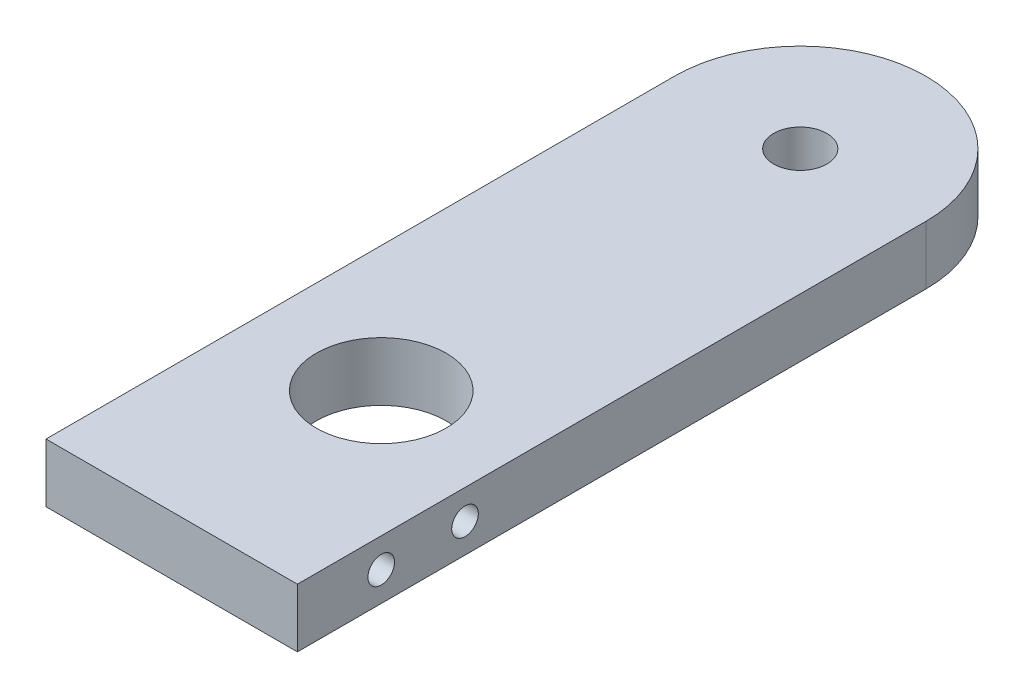
ISO-10303-21;
HEADER;
FILE_DESCRIPTION(('STEP AP214'),'2;1');
FILE_NAME('part.step','',(''),(''),'','','');
FILE_SCHEMA(('AUTOMOTIVE_DESIGN { 1 0 10303 214 1 1 1 1 }'));
ENDSEC;
DATA;
#1=APPLICATION_CONTEXT('core data for automotive mechanical design processes');
#2=APPLICATION_PROTOCOL_DEFINITION('international standard','automotive_design',2000,#1);
#3=PRODUCT_CONTEXT('',#1,'mechanical');
#4=PRODUCT('Part','Part','',(#3));
#5=PRODUCT_RELATED_PRODUCT_CATEGORY('part','',(#4));
#6=PRODUCT_DEFINITION_FORMATION('','',#4);
#7=PRODUCT_DEFINITION_CONTEXT('part definition',#1,'design');
#8=PRODUCT_DEFINITION('design','',#6,#7);
#9=PRODUCT_DEFINITION_SHAPE('','',#8);
#10=(LENGTH_UNIT() NAMED_UNIT(*) SI_UNIT(.MILLI.,.METRE.));
#11=(NAMED_UNIT(*) PLANE_ANGLE_UNIT() SI_UNIT($,.RADIAN.));
#12=(NAMED_UNIT(*) SI_UNIT($,.STERADIAN.) SOLID_ANGLE_UNIT());
#13=UNCERTAINTY_MEASURE_WITH_UNIT(LENGTH_MEASURE(1.E-05),#10,'distance_accuracy_value','');
#14=(GEOMETRIC_REPRESENTATION_CONTEXT(3) GLOBAL_UNCERTAINTY_ASSIGNED_CONTEXT((#13)) GLOBAL_UNIT_ASSIGNED_CONTEXT((#10,
#11,#12)) REPRESENTATION_CONTEXT('',''));
#15=CARTESIAN_POINT('',(0.,0.,0.));
#16=DIRECTION('',(0.,0.,1.));
#17=DIRECTION('',(1.,0.,0.));
#18=AXIS2_PLACEMENT_3D('',#15,#16,#17);
#19=CARTESIAN_POINT('',(-140.801197544741,7.,-45.351992913343));
#20=DIRECTION('',(0.,1.,0.));
#21=DIRECTION('',(0.,0.,1.));
#22=AXIS2_PLACEMENT_3D('',#19,#20,#21);
#23=PLANE('',#22);
#24=CARTESIAN_POINT('',(-140.801197544741,7.00000000000001,-45.351992913343));
#25=DIRECTION('',(0.,-1.,0.));
#26=DIRECTION('',(0.,0.,-1.));
#27=AXIS2_PLACEMENT_3D('',#24,#25,#26);
#28=CIRCLE('',#27,3.17499999999998);
#29=CARTESIAN_POINT('',(-140.801197544741,7.00000000000001,-48.526992913343));
#30=VERTEX_POINT('',#29);
#31=EDGE_CURVE('E154',#30,#30,#28,.T.);
#32=ORIENTED_EDGE('',*,*,#31,.T.);
#33=EDGE_LOOP('',(#32));
#34=FACE_BOUND('',#33,.T.);
#35=DIRECTION('',(1.,0.,0.));
#36=VECTOR('',#35,1.);
#37=CARTESIAN_POINT('',(-155.801197544741,7.,29.648007086657));
#38=LINE('',#37,#36);
#39=CARTESIAN_POINT('',(-155.801197544741,7.,29.648007086657));
#40=VERTEX_POINT('',#39);
#41=CARTESIAN_POINT('',(-125.801197544741,7.,29.648007086657));
#42=VERTEX_POINT('',#41);
#43=EDGE_CURVE('E98',#40,#42,#38,.T.);
#44=ORIENTED_EDGE('',*,*,#43,.T.);
#45=DIRECTION('',(0.,0.,-1.));
#46=VECTOR('',#45,1.);
#47=CARTESIAN_POINT('',(-125.801197544741,7.,29.648007086657));
#48=LINE('',#47,#46);
#49=CARTESIAN_POINT('',(-125.801197544741,7.,-45.351992913343));
#50=VERTEX_POINT('',#49);
#51=EDGE_CURVE('E101',#42,#50,#48,.T.);
#52=ORIENTED_EDGE('',*,*,#51,.T.);
#53=CARTESIAN_POINT('',(-140.801197544741,7.,-45.351992913343));
#54=DIRECTION('',(0.,1.,0.));
#55=DIRECTION('',(0.,0.,1.));
#56=AXIS2_PLACEMENT_3D('',#53,#54,#55);
#57=CIRCLE('',#56,15.0000000000001);
#58=CARTESIAN_POINT('',(-155.801197544741,7.,-45.351992913343));
#59=VERTEX_POINT('',#58);
#60=EDGE_CURVE('E83',#50,#59,#57,.T.);
#61=ORIENTED_EDGE('',*,*,#60,.T.);
#62=DIRECTION('',(0.,0.,1.));
#63=VECTOR('',#62,1.);
#64=CARTESIAN_POINT('',(-155.801197544741,7.,-45.351992913343));
#65=LINE('',#64,#63);
#66=EDGE_CURVE('E93',#59,#40,#65,.T.);
#67=ORIENTED_EDGE('',*,*,#66,.T.);
#68=EDGE_LOOP('',(#44,#52,#61,#67));
#69=FACE_BOUND('',#68,.T.);
#70=CARTESIAN_POINT('',(-140.801197544741,7.00000000000001,4.648007086657));
#71=DIRECTION('',(0.,-1.,0.));
#72=DIRECTION('',(0.,0.,-1.));
#73=AXIS2_PLACEMENT_3D('',#70,#71,#72);
#74=CIRCLE('',#73,7.75000000000001);
#75=CARTESIAN_POINT('',(-140.801197544741,7.00000000000001,-3.10199291334301));
#76=VERTEX_POINT('',#75);
#77=EDGE_CURVE('E164',#76,#76,#74,.T.);
#78=ORIENTED_EDGE('',*,*,#77,.T.);
#79=EDGE_LOOP('',(#78));
#80=FACE_BOUND('',#79,.T.);
#81=ADVANCED_FACE('F32',(#34,#69,#80),#23,.T.);
#82=CARTESIAN_POINT('',(-155.801197544741,0.,29.648007086657));
#83=DIRECTION('',(0.,0.,1.));
#84=DIRECTION('',(1.,0.,0.));
#85=AXIS2_PLACEMENT_3D('',#82,#83,#84);
#86=PLANE('',#85);
#87=ORIENTED_EDGE('',*,*,#43,.F.);
#88=DIRECTION('',(0.,1.,0.));
#89=VECTOR('',#88,1.);
#90=CARTESIAN_POINT('',(-155.801197544741,0.,29.648007086657));
#91=LINE('',#90,#89);
#92=CARTESIAN_POINT('',(-155.801197544741,0.,29.648007086657));
#93=VERTEX_POINT('',#92);
#94=EDGE_CURVE('E11',#93,#40,#91,.T.);
#95=ORIENTED_EDGE('',*,*,#94,.F.);
#96=DIRECTION('',(1.,0.,0.));
#97=VECTOR('',#96,1.);
#98=CARTESIAN_POINT('',(-155.801197544741,0.,29.648007086657));
#99=LINE('',#98,#97);
#100=CARTESIAN_POINT('',(-125.801197544741,0.,29.648007086657));
#101=VERTEX_POINT('',#100);
#102=EDGE_CURVE('E91',#93,#101,#99,.T.);
#103=ORIENTED_EDGE('',*,*,#102,.T.);
#104=DIRECTION('',(0.,1.,0.));
#105=VECTOR('',#104,1.);
#106=CARTESIAN_POINT('',(-125.801197544741,0.,29.648007086657));
#107=LINE('',#106,#105);
#108=EDGE_CURVE('E36',#101,#42,#107,.T.);
#109=ORIENTED_EDGE('',*,*,#108,.T.);
#110=EDGE_LOOP('',(#87,#95,#103,#109));
#111=FACE_BOUND('',#110,.T.);
#112=ADVANCED_FACE('F34',(#111),#86,.T.);
#113=CARTESIAN_POINT('',(-155.801197544741,0.,-45.351992913343));
#114=DIRECTION('',(-1.,0.,0.));
#115=DIRECTION('',(0.,0.,1.));
#116=AXIS2_PLACEMENT_3D('',#113,#114,#115);
#117=PLANE('',#116);
#118=ORIENTED_EDGE('',*,*,#66,.F.);
#119=DIRECTION('',(0.,1.,0.));
#120=VECTOR('',#119,1.);
#121=CARTESIAN_POINT('',(-155.801197544741,0.,-45.351992913343));
#122=LINE('',#121,#120);
#123=CARTESIAN_POINT('',(-155.801197544741,0.,-45.351992913343));
#124=VERTEX_POINT('',#123);
#125=EDGE_CURVE('E42',#124,#59,#122,.T.);
#126=ORIENTED_EDGE('',*,*,#125,.F.);
#127=DIRECTION('',(0.,0.,1.));
#128=VECTOR('',#127,1.);
#129=CARTESIAN_POINT('',(-155.801197544741,0.,-45.351992913343));
#130=LINE('',#129,#128);
#131=EDGE_CURVE('E88',#124,#93,#130,.T.);
#132=ORIENTED_EDGE('',*,*,#131,.T.);
#133=ORIENTED_EDGE('',*,*,#94,.T.);
#134=EDGE_LOOP('',(#118,#126,#132,#133));
#135=FACE_BOUND('',#134,.T.);
#136=ADVANCED_FACE('F109',(#135),#117,.T.);
#137=CARTESIAN_POINT('',(-140.801197544741,0.,-45.351992913343));
#138=DIRECTION('',(0.,1.,0.));
#139=DIRECTION('',(0.,0.,1.));
#140=AXIS2_PLACEMENT_3D('',#137,#138,#139);
#141=CYLINDRICAL_SURFACE('',#140,15.0000000000001);
#142=ORIENTED_EDGE('',*,*,#60,.F.);
#143=DIRECTION('',(0.,1.,0.));
#144=VECTOR('',#143,1.);
#145=CARTESIAN_POINT('',(-125.801197544741,0.,-45.351992913343));
#146=LINE('',#145,#144);
#147=CARTESIAN_POINT('',(-125.801197544741,0.,-45.351992913343));
#148=VERTEX_POINT('',#147);
#149=EDGE_CURVE('E78',#148,#50,#146,.T.);
#150=ORIENTED_EDGE('',*,*,#149,.F.);
#151=CARTESIAN_POINT('',(-140.801197544741,0.,-45.351992913343));
#152=DIRECTION('',(0.,1.,0.));
#153=DIRECTION('',(0.,0.,1.));
#154=AXIS2_PLACEMENT_3D('',#151,#152,#153);
#155=CIRCLE('',#154,15.0000000000001);
#156=EDGE_CURVE('E81',#148,#124,#155,.T.);
#157=ORIENTED_EDGE('',*,*,#156,.T.);
#158=ORIENTED_EDGE('',*,*,#125,.T.);
#159=EDGE_LOOP('',(#142,#150,#157,#158));
#160=FACE_BOUND('',#159,.T.);
#161=ADVANCED_FACE('F80',(#160),#141,.T.);
#162=CARTESIAN_POINT('',(-125.801197544741,0.,29.648007086657));
#163=DIRECTION('',(1.,0.,0.));
#164=DIRECTION('',(0.,0.,-1.));
#165=AXIS2_PLACEMENT_3D('',#162,#163,#164);
#166=PLANE('',#165);
#167=CARTESIAN_POINT('',(-125.801197544741,3.5,19.648007086657));
#168=DIRECTION('',(1.,0.,0.));
#169=DIRECTION('',(0.,0.,-1.));
#170=AXIS2_PLACEMENT_3D('',#167,#168,#169);
#171=CIRCLE('',#170,1.5875);
#172=CARTESIAN_POINT('',(-125.801197544741,3.5,18.060507086657));
#173=VERTEX_POINT('',#172);
#174=EDGE_CURVE('E167',#173,#173,#171,.T.);
#175=ORIENTED_EDGE('',*,*,#174,.F.);
#176=EDGE_LOOP('',(#175));
#177=FACE_BOUND('',#176,.T.);
#178=CARTESIAN_POINT('',(-125.801197544741,3.5,9.648007086657));
#179=DIRECTION('',(1.,0.,0.));
#180=DIRECTION('',(0.,0.,-1.));
#181=AXIS2_PLACEMENT_3D('',#178,#179,#180);
#182=CIRCLE('',#181,1.5875);
#183=CARTESIAN_POINT('',(-125.801197544741,3.5,8.060507086657));
#184=VERTEX_POINT('',#183);
#185=EDGE_CURVE('E173',#184,#184,#182,.T.);
#186=ORIENTED_EDGE('',*,*,#185,.F.);
#187=EDGE_LOOP('',(#186));
#188=FACE_BOUND('',#187,.T.);
#189=ORIENTED_EDGE('',*,*,#51,.F.);
#190=ORIENTED_EDGE('',*,*,#108,.F.);
#191=DIRECTION('',(0.,0.,-1.));
#192=VECTOR('',#191,1.);
#193=CARTESIAN_POINT('',(-125.801197544741,0.,29.648007086657));
#194=LINE('',#193,#192);
#195=EDGE_CURVE('E87',#101,#148,#194,.T.);
#196=ORIENTED_EDGE('',*,*,#195,.T.);
#197=ORIENTED_EDGE('',*,*,#149,.T.);
#198=EDGE_LOOP('',(#189,#190,#196,#197));
#199=FACE_BOUND('',#198,.T.);
#200=ADVANCED_FACE('F90',(#177,#188,#199),#166,.T.);
#201=CARTESIAN_POINT('',(-140.801197544741,0.,-45.351992913343));
#202=DIRECTION('',(0.,1.,0.));
#203=DIRECTION('',(0.,0.,1.));
#204=AXIS2_PLACEMENT_3D('',#201,#202,#203);
#205=PLANE('',#204);
#206=CARTESIAN_POINT('',(-140.801197544741,0.,-45.351992913343));
#207=DIRECTION('',(0.,-1.,0.));
#208=DIRECTION('',(0.,0.,-1.));
#209=AXIS2_PLACEMENT_3D('',#206,#207,#208);
#210=CIRCLE('',#209,3.17499999999998);
#211=CARTESIAN_POINT('',(-140.801197544741,0.,-48.526992913343));
#212=VERTEX_POINT('',#211);
#213=EDGE_CURVE('E157',#212,#212,#210,.T.);
#214=ORIENTED_EDGE('',*,*,#213,.F.);
#215=EDGE_LOOP('',(#214));
#216=FACE_BOUND('',#215,.T.);
#217=CARTESIAN_POINT('',(-140.801197544741,0.,4.648007086657));
#218=DIRECTION('',(0.,-1.,0.));
#219=DIRECTION('',(0.,0.,-1.));
#220=AXIS2_PLACEMENT_3D('',#217,#218,#219);
#221=CIRCLE('',#220,7.75000000000001);
#222=CARTESIAN_POINT('',(-140.801197544741,0.,-3.10199291334301));
#223=VERTEX_POINT('',#222);
#224=EDGE_CURVE('E159',#223,#223,#221,.T.);
#225=ORIENTED_EDGE('',*,*,#224,.F.);
#226=EDGE_LOOP('',(#225));
#227=FACE_BOUND('',#226,.T.);
#228=ORIENTED_EDGE('',*,*,#102,.F.);
#229=ORIENTED_EDGE('',*,*,#131,.F.);
#230=ORIENTED_EDGE('',*,*,#156,.F.);
#231=ORIENTED_EDGE('',*,*,#195,.F.);
#232=EDGE_LOOP('',(#228,#229,#230,#231));
#233=FACE_BOUND('',#232,.T.);
#234=ADVANCED_FACE('F86',(#216,#227,#233),#205,.F.);
#235=CARTESIAN_POINT('',(-129.865197544741,3.5,9.648007086657));
#236=DIRECTION('',(-1.,0.,0.));
#237=DIRECTION('',(0.,0.,1.));
#238=AXIS2_PLACEMENT_3D('',#235,#236,#237);
#239=PLANE('',#238);
#240=CARTESIAN_POINT('',(-129.865197544741,3.5,9.648007086657));
#241=DIRECTION('',(1.,0.,0.));
#242=DIRECTION('',(0.,0.,-1.));
#243=AXIS2_PLACEMENT_3D('',#240,#241,#242);
#244=CIRCLE('',#243,1.5875);
#245=CARTESIAN_POINT('',(-129.865197544741,3.5,8.060507086657));
#246=VERTEX_POINT('',#245);
#247=EDGE_CURVE('E102',#246,#246,#244,.T.);
#248=ORIENTED_EDGE('',*,*,#247,.T.);
#249=EDGE_LOOP('',(#248));
#250=FACE_BOUND('',#249,.T.);
#251=ADVANCED_FACE('F126',(#250),#239,.F.);
#252=CARTESIAN_POINT('',(-125.801197544741,3.5,9.648007086657));
#253=DIRECTION('',(1.,0.,0.));
#254=DIRECTION('',(0.,0.,-1.));
#255=AXIS2_PLACEMENT_3D('',#252,#253,#254);
#256=CYLINDRICAL_SURFACE('',#255,1.5875);
#257=ORIENTED_EDGE('',*,*,#247,.F.);
#258=EDGE_LOOP('',(#257));
#259=FACE_BOUND('',#258,.T.);
#260=ORIENTED_EDGE('',*,*,#185,.T.);
#261=EDGE_LOOP('',(#260));
#262=FACE_BOUND('',#261,.T.);
#263=ADVANCED_FACE('F130',(#259,#262),#256,.F.);
#264=CARTESIAN_POINT('',(-129.865197544741,3.5,19.648007086657));
#265=DIRECTION('',(-1.,0.,0.));
#266=DIRECTION('',(0.,0.,1.));
#267=AXIS2_PLACEMENT_3D('',#264,#265,#266);
#268=PLANE('',#267);
#269=CARTESIAN_POINT('',(-129.865197544741,3.5,19.648007086657));
#270=DIRECTION('',(1.,0.,0.));
#271=DIRECTION('',(0.,0.,-1.));
#272=AXIS2_PLACEMENT_3D('',#269,#270,#271);
#273=CIRCLE('',#272,1.5875);
#274=CARTESIAN_POINT('',(-129.865197544741,3.5,18.060507086657));
#275=VERTEX_POINT('',#274);
#276=EDGE_CURVE('E170',#275,#275,#273,.T.);
#277=ORIENTED_EDGE('',*,*,#276,.T.);
#278=EDGE_LOOP('',(#277));
#279=FACE_BOUND('',#278,.T.);
#280=ADVANCED_FACE('F134',(#279),#268,.F.);
#281=CARTESIAN_POINT('',(-125.801197544741,3.5,19.648007086657));
#282=DIRECTION('',(1.,0.,0.));
#283=DIRECTION('',(0.,0.,-1.));
#284=AXIS2_PLACEMENT_3D('',#281,#282,#283);
#285=CYLINDRICAL_SURFACE('',#284,1.5875);
#286=ORIENTED_EDGE('',*,*,#276,.F.);
#287=EDGE_LOOP('',(#286));
#288=FACE_BOUND('',#287,.T.);
#289=ORIENTED_EDGE('',*,*,#174,.T.);
#290=EDGE_LOOP('',(#289));
#291=FACE_BOUND('',#290,.T.);
#292=ADVANCED_FACE('F138',(#288,#291),#285,.F.);
#293=CARTESIAN_POINT('',(-140.801197544741,0.,4.648007086657));
#294=DIRECTION('',(0.,-1.,0.));
#295=DIRECTION('',(0.,0.,-1.));
#296=AXIS2_PLACEMENT_3D('',#293,#294,#295);
#297=CYLINDRICAL_SURFACE('',#296,7.75000000000001);
#298=ORIENTED_EDGE('',*,*,#77,.F.);
#299=EDGE_LOOP('',(#298));
#300=FACE_BOUND('',#299,.T.);
#301=ORIENTED_EDGE('',*,*,#224,.T.);
#302=EDGE_LOOP('',(#301));
#303=FACE_BOUND('',#302,.T.);
#304=ADVANCED_FACE('F142',(#300,#303),#297,.F.);
#305=CARTESIAN_POINT('',(-140.801197544741,0.,-45.351992913343));
#306=DIRECTION('',(0.,-1.,0.));
#307=DIRECTION('',(0.,0.,-1.));
#308=AXIS2_PLACEMENT_3D('',#305,#306,#307);
#309=CYLINDRICAL_SURFACE('',#308,3.17499999999998);
#310=ORIENTED_EDGE('',*,*,#31,.F.);
#311=EDGE_LOOP('',(#310));
#312=FACE_BOUND('',#311,.T.);
#313=ORIENTED_EDGE('',*,*,#213,.T.);
#314=EDGE_LOOP('',(#313));
#315=FACE_BOUND('',#314,.T.);
#316=ADVANCED_FACE('F146',(#312,#315),#309,.F.);
#317=CLOSED_SHELL('',(#81,#112,#136,#161,#200,#234,#251,#263,#280,#292,#304,#316));
#318=MANIFOLD_SOLID_BREP('B2',#317);
#319=ADVANCED_BREP_SHAPE_REPRESENTATION('',(#18,#318),#14);
#320=SHAPE_DEFINITION_REPRESENTATION(#9,#319);
ENDSEC;
END-ISO-10303-21;
